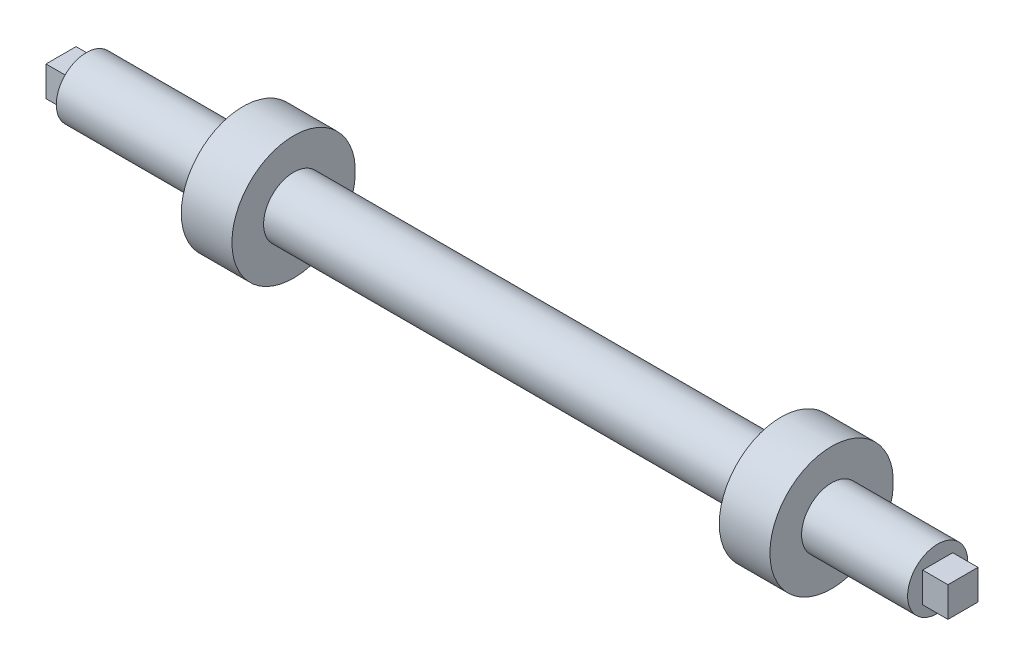
ISO-10303-21;
HEADER;
FILE_DESCRIPTION(('STEP AP214'),'2;1');
FILE_NAME('part.step','',(''),(''),'','','');
FILE_SCHEMA(('AUTOMOTIVE_DESIGN { 1 0 10303 214 1 1 1 1 }'));
ENDSEC;
DATA;
#1=APPLICATION_CONTEXT('core data for automotive mechanical design processes');
#2=APPLICATION_PROTOCOL_DEFINITION('international standard','automotive_design',2000,#1);
#3=PRODUCT_CONTEXT('',#1,'mechanical');
#4=PRODUCT('Part','Part','',(#3));
#5=PRODUCT_RELATED_PRODUCT_CATEGORY('part','',(#4));
#6=PRODUCT_DEFINITION_FORMATION('','',#4);
#7=PRODUCT_DEFINITION_CONTEXT('part definition',#1,'design');
#8=PRODUCT_DEFINITION('design','',#6,#7);
#9=PRODUCT_DEFINITION_SHAPE('','',#8);
#10=(LENGTH_UNIT() NAMED_UNIT(*) SI_UNIT(.MILLI.,.METRE.));
#11=(NAMED_UNIT(*) PLANE_ANGLE_UNIT() SI_UNIT($,.RADIAN.));
#12=(NAMED_UNIT(*) SI_UNIT($,.STERADIAN.) SOLID_ANGLE_UNIT());
#13=UNCERTAINTY_MEASURE_WITH_UNIT(LENGTH_MEASURE(1.E-05),#10,'distance_accuracy_value','');
#14=(GEOMETRIC_REPRESENTATION_CONTEXT(3) GLOBAL_UNCERTAINTY_ASSIGNED_CONTEXT((#13)) GLOBAL_UNIT_ASSIGNED_CONTEXT((#10,
#11,#12)) REPRESENTATION_CONTEXT('',''));
#15=CARTESIAN_POINT('',(0.,0.,0.));
#16=DIRECTION('',(0.,0.,1.));
#17=DIRECTION('',(1.,0.,0.));
#18=AXIS2_PLACEMENT_3D('',#15,#16,#17);
#19=CARTESIAN_POINT('',(0.,0.,-4.75));
#20=DIRECTION('',(-1.,0.,0.));
#21=DIRECTION('',(0.,0.,1.));
#22=AXIS2_PLACEMENT_3D('',#19,#20,#21);
#23=CYLINDRICAL_SURFACE('',#22,4.75);
#24=CARTESIAN_POINT('',(24.75,0.,-4.75));
#25=DIRECTION('',(-1.,0.,0.));
#26=DIRECTION('',(0.,0.,1.));
#27=AXIS2_PLACEMENT_3D('',#24,#25,#26);
#28=CIRCLE('',#27,4.75);
#29=CARTESIAN_POINT('',(24.75,0.,0.));
#30=VERTEX_POINT('',#29);
#31=EDGE_CURVE('E199',#30,#30,#28,.T.);
#32=ORIENTED_EDGE('',*,*,#31,.T.);
#33=EDGE_LOOP('',(#32));
#34=FACE_BOUND('',#33,.T.);
#35=CARTESIAN_POINT('',(0.,0.,-4.75));
#36=DIRECTION('',(-1.,0.,0.));
#37=DIRECTION('',(0.,0.,1.));
#38=AXIS2_PLACEMENT_3D('',#35,#36,#37);
#39=CIRCLE('',#38,4.75);
#40=CARTESIAN_POINT('',(0.,0.,0.));
#41=VERTEX_POINT('',#40);
#42=EDGE_CURVE('E11',#41,#41,#39,.T.);
#43=ORIENTED_EDGE('',*,*,#42,.F.);
#44=EDGE_LOOP('',(#43));
#45=FACE_BOUND('',#44,.T.);
#46=ADVANCED_FACE('F41',(#34,#45),#23,.T.);
#47=CARTESIAN_POINT('',(0.,0.,0.));
#48=DIRECTION('',(-1.,0.,0.));
#49=DIRECTION('',(0.,0.,1.));
#50=AXIS2_PLACEMENT_3D('',#47,#48,#49);
#51=PLANE('',#50);
#52=DIRECTION('',(0.,0.,-1.));
#53=VECTOR('',#52,1.);
#54=CARTESIAN_POINT('',(0.,2.375,-4.75));
#55=LINE('',#54,#53);
#56=CARTESIAN_POINT('',(0.,2.375,-2.375));
#57=VERTEX_POINT('',#56);
#58=CARTESIAN_POINT('',(0.,2.375,-7.125));
#59=VERTEX_POINT('',#58);
#60=EDGE_CURVE('E56',#57,#59,#55,.T.);
#61=ORIENTED_EDGE('',*,*,#60,.F.);
#62=DIRECTION('',(0.,1.,0.));
#63=VECTOR('',#62,1.);
#64=CARTESIAN_POINT('',(0.,-2.375,-2.375));
#65=LINE('',#64,#63);
#66=CARTESIAN_POINT('',(0.,-2.375,-2.375));
#67=VERTEX_POINT('',#66);
#68=EDGE_CURVE('E60',#67,#57,#65,.T.);
#69=ORIENTED_EDGE('',*,*,#68,.F.);
#70=DIRECTION('',(0.,0.,1.));
#71=VECTOR('',#70,1.);
#72=CARTESIAN_POINT('',(0.,-2.375,-7.125));
#73=LINE('',#72,#71);
#74=CARTESIAN_POINT('',(0.,-2.375,-7.125));
#75=VERTEX_POINT('',#74);
#76=EDGE_CURVE('E142',#75,#67,#73,.T.);
#77=ORIENTED_EDGE('',*,*,#76,.F.);
#78=DIRECTION('',(0.,-1.,0.));
#79=VECTOR('',#78,1.);
#80=CARTESIAN_POINT('',(0.,2.375,-7.125));
#81=LINE('',#80,#79);
#82=EDGE_CURVE('E139',#59,#75,#81,.T.);
#83=ORIENTED_EDGE('',*,*,#82,.F.);
#84=EDGE_LOOP('',(#61,#69,#77,#83));
#85=FACE_BOUND('',#84,.T.);
#86=ORIENTED_EDGE('',*,*,#42,.T.);
#87=EDGE_LOOP('',(#86));
#88=FACE_BOUND('',#87,.T.);
#89=ADVANCED_FACE('F239',(#85,#88),#51,.T.);
#90=CARTESIAN_POINT('',(134.5,0.,-4.75));
#91=DIRECTION('',(1.,0.,0.));
#92=DIRECTION('',(0.,0.,-1.));
#93=AXIS2_PLACEMENT_3D('',#90,#91,#92);
#94=PLANE('',#93);
#95=DIRECTION('',(0.,0.,1.));
#96=VECTOR('',#95,1.);
#97=CARTESIAN_POINT('',(134.5,2.375,-2.375));
#98=LINE('',#97,#96);
#99=CARTESIAN_POINT('',(134.5,2.375,-7.125));
#100=VERTEX_POINT('',#99);
#101=CARTESIAN_POINT('',(134.5,2.375,-2.375));
#102=VERTEX_POINT('',#101);
#103=EDGE_CURVE('E122',#100,#102,#98,.T.);
#104=ORIENTED_EDGE('',*,*,#103,.F.);
#105=DIRECTION('',(0.,1.,0.));
#106=VECTOR('',#105,1.);
#107=CARTESIAN_POINT('',(134.5,2.375,-7.125));
#108=LINE('',#107,#106);
#109=CARTESIAN_POINT('',(134.5,-2.375,-7.125));
#110=VERTEX_POINT('',#109);
#111=EDGE_CURVE('E160',#110,#100,#108,.T.);
#112=ORIENTED_EDGE('',*,*,#111,.F.);
#113=DIRECTION('',(0.,0.,-1.));
#114=VECTOR('',#113,1.);
#115=CARTESIAN_POINT('',(134.5,-2.375,-7.125));
#116=LINE('',#115,#114);
#117=CARTESIAN_POINT('',(134.5,-2.375,-2.375));
#118=VERTEX_POINT('',#117);
#119=EDGE_CURVE('E177',#118,#110,#116,.T.);
#120=ORIENTED_EDGE('',*,*,#119,.F.);
#121=DIRECTION('',(0.,-1.,0.));
#122=VECTOR('',#121,1.);
#123=CARTESIAN_POINT('',(134.5,2.375,-2.375));
#124=LINE('',#123,#122);
#125=EDGE_CURVE('E173',#102,#118,#124,.T.);
#126=ORIENTED_EDGE('',*,*,#125,.F.);
#127=EDGE_LOOP('',(#104,#112,#120,#126));
#128=FACE_BOUND('',#127,.T.);
#129=CARTESIAN_POINT('',(134.5,0.,-4.75));
#130=DIRECTION('',(-1.,0.,0.));
#131=DIRECTION('',(0.,0.,1.));
#132=AXIS2_PLACEMENT_3D('',#129,#130,#131);
#133=CIRCLE('',#132,4.75);
#134=CARTESIAN_POINT('',(134.5,0.,0.));
#135=VERTEX_POINT('',#134);
#136=EDGE_CURVE('E49',#135,#135,#133,.T.);
#137=ORIENTED_EDGE('',*,*,#136,.F.);
#138=EDGE_LOOP('',(#137));
#139=FACE_BOUND('',#138,.T.);
#140=ADVANCED_FACE('F237',(#128,#139),#94,.T.);
#141=CARTESIAN_POINT('',(0.,0.,-4.75));
#142=DIRECTION('',(-1.,0.,0.));
#143=DIRECTION('',(0.,0.,1.));
#144=AXIS2_PLACEMENT_3D('',#141,#142,#143);
#145=CYLINDRICAL_SURFACE('',#144,4.75);
#146=ORIENTED_EDGE('',*,*,#136,.T.);
#147=EDGE_LOOP('',(#146));
#148=FACE_BOUND('',#147,.T.);
#149=CARTESIAN_POINT('',(117.75,0.,-4.75));
#150=DIRECTION('',(-1.,0.,0.));
#151=DIRECTION('',(0.,0.,1.));
#152=AXIS2_PLACEMENT_3D('',#149,#150,#151);
#153=CIRCLE('',#152,4.75);
#154=CARTESIAN_POINT('',(117.75,0.,0.));
#155=VERTEX_POINT('',#154);
#156=EDGE_CURVE('E227',#155,#155,#153,.T.);
#157=ORIENTED_EDGE('',*,*,#156,.F.);
#158=EDGE_LOOP('',(#157));
#159=FACE_BOUND('',#158,.T.);
#160=ADVANCED_FACE('F234',(#148,#159),#145,.T.);
#161=CARTESIAN_POINT('',(117.75,0.,5.));
#162=DIRECTION('',(1.,0.,0.));
#163=DIRECTION('',(0.,0.,-1.));
#164=AXIS2_PLACEMENT_3D('',#161,#162,#163);
#165=PLANE('',#164);
#166=ORIENTED_EDGE('',*,*,#156,.T.);
#167=EDGE_LOOP('',(#166));
#168=FACE_BOUND('',#167,.T.);
#169=CARTESIAN_POINT('',(117.75,0.,-4.75));
#170=DIRECTION('',(-1.,0.,0.));
#171=DIRECTION('',(0.,0.,1.));
#172=AXIS2_PLACEMENT_3D('',#169,#170,#171);
#173=CIRCLE('',#172,9.75);
#174=CARTESIAN_POINT('',(117.75,0.,5.));
#175=VERTEX_POINT('',#174);
#176=EDGE_CURVE('E223',#175,#175,#173,.T.);
#177=ORIENTED_EDGE('',*,*,#176,.F.);
#178=EDGE_LOOP('',(#177));
#179=FACE_BOUND('',#178,.T.);
#180=ADVANCED_FACE('F246',(#168,#179),#165,.T.);
#181=CARTESIAN_POINT('',(0.,0.,-4.75));
#182=DIRECTION('',(-1.,0.,0.));
#183=DIRECTION('',(0.,0.,1.));
#184=AXIS2_PLACEMENT_3D('',#181,#182,#183);
#185=CYLINDRICAL_SURFACE('',#184,9.75);
#186=ORIENTED_EDGE('',*,*,#176,.T.);
#187=EDGE_LOOP('',(#186));
#188=FACE_BOUND('',#187,.T.);
#189=CARTESIAN_POINT('',(109.75,0.,-4.75));
#190=DIRECTION('',(-1.,0.,0.));
#191=DIRECTION('',(0.,0.,1.));
#192=AXIS2_PLACEMENT_3D('',#189,#190,#191);
#193=CIRCLE('',#192,9.75);
#194=CARTESIAN_POINT('',(109.75,0.,5.));
#195=VERTEX_POINT('',#194);
#196=EDGE_CURVE('E219',#195,#195,#193,.T.);
#197=ORIENTED_EDGE('',*,*,#196,.F.);
#198=EDGE_LOOP('',(#197));
#199=FACE_BOUND('',#198,.T.);
#200=ADVANCED_FACE('F285',(#188,#199),#185,.T.);
#201=CARTESIAN_POINT('',(109.75,0.,0.));
#202=DIRECTION('',(-1.,0.,0.));
#203=DIRECTION('',(0.,0.,1.));
#204=AXIS2_PLACEMENT_3D('',#201,#202,#203);
#205=PLANE('',#204);
#206=ORIENTED_EDGE('',*,*,#196,.T.);
#207=EDGE_LOOP('',(#206));
#208=FACE_BOUND('',#207,.T.);
#209=CARTESIAN_POINT('',(109.75,0.,-4.75));
#210=DIRECTION('',(-1.,0.,0.));
#211=DIRECTION('',(0.,0.,1.));
#212=AXIS2_PLACEMENT_3D('',#209,#210,#211);
#213=CIRCLE('',#212,4.75);
#214=CARTESIAN_POINT('',(109.75,0.,0.));
#215=VERTEX_POINT('',#214);
#216=EDGE_CURVE('E215',#215,#215,#213,.T.);
#217=ORIENTED_EDGE('',*,*,#216,.F.);
#218=EDGE_LOOP('',(#217));
#219=FACE_BOUND('',#218,.T.);
#220=ADVANCED_FACE('F281',(#208,#219),#205,.T.);
#221=CARTESIAN_POINT('',(0.,0.,-4.75));
#222=DIRECTION('',(-1.,0.,0.));
#223=DIRECTION('',(0.,0.,1.));
#224=AXIS2_PLACEMENT_3D('',#221,#222,#223);
#225=CYLINDRICAL_SURFACE('',#224,4.75);
#226=ORIENTED_EDGE('',*,*,#216,.T.);
#227=EDGE_LOOP('',(#226));
#228=FACE_BOUND('',#227,.T.);
#229=CARTESIAN_POINT('',(32.75,0.,-4.75));
#230=DIRECTION('',(-1.,0.,0.));
#231=DIRECTION('',(0.,0.,1.));
#232=AXIS2_PLACEMENT_3D('',#229,#230,#231);
#233=CIRCLE('',#232,4.75);
#234=CARTESIAN_POINT('',(32.75,0.,0.));
#235=VERTEX_POINT('',#234);
#236=EDGE_CURVE('E211',#235,#235,#233,.T.);
#237=ORIENTED_EDGE('',*,*,#236,.F.);
#238=EDGE_LOOP('',(#237));
#239=FACE_BOUND('',#238,.T.);
#240=ADVANCED_FACE('F277',(#228,#239),#225,.T.);
#241=CARTESIAN_POINT('',(32.75,0.,5.));
#242=DIRECTION('',(1.,0.,0.));
#243=DIRECTION('',(0.,0.,-1.));
#244=AXIS2_PLACEMENT_3D('',#241,#242,#243);
#245=PLANE('',#244);
#246=ORIENTED_EDGE('',*,*,#236,.T.);
#247=EDGE_LOOP('',(#246));
#248=FACE_BOUND('',#247,.T.);
#249=CARTESIAN_POINT('',(32.75,0.,-4.75));
#250=DIRECTION('',(-1.,0.,0.));
#251=DIRECTION('',(0.,0.,1.));
#252=AXIS2_PLACEMENT_3D('',#249,#250,#251);
#253=CIRCLE('',#252,9.75);
#254=CARTESIAN_POINT('',(32.75,0.,5.));
#255=VERTEX_POINT('',#254);
#256=EDGE_CURVE('E207',#255,#255,#253,.T.);
#257=ORIENTED_EDGE('',*,*,#256,.F.);
#258=EDGE_LOOP('',(#257));
#259=FACE_BOUND('',#258,.T.);
#260=ADVANCED_FACE('F270',(#248,#259),#245,.T.);
#261=CARTESIAN_POINT('',(0.,0.,-4.75));
#262=DIRECTION('',(-1.,0.,0.));
#263=DIRECTION('',(0.,0.,1.));
#264=AXIS2_PLACEMENT_3D('',#261,#262,#263);
#265=CYLINDRICAL_SURFACE('',#264,9.75);
#266=ORIENTED_EDGE('',*,*,#256,.T.);
#267=EDGE_LOOP('',(#266));
#268=FACE_BOUND('',#267,.T.);
#269=CARTESIAN_POINT('',(24.75,0.,-4.75));
#270=DIRECTION('',(-1.,0.,0.));
#271=DIRECTION('',(0.,0.,1.));
#272=AXIS2_PLACEMENT_3D('',#269,#270,#271);
#273=CIRCLE('',#272,9.75);
#274=CARTESIAN_POINT('',(24.75,0.,5.));
#275=VERTEX_POINT('',#274);
#276=EDGE_CURVE('E203',#275,#275,#273,.T.);
#277=ORIENTED_EDGE('',*,*,#276,.F.);
#278=EDGE_LOOP('',(#277));
#279=FACE_BOUND('',#278,.T.);
#280=ADVANCED_FACE('F260',(#268,#279),#265,.T.);
#281=CARTESIAN_POINT('',(24.75,0.,0.));
#282=DIRECTION('',(-1.,0.,0.));
#283=DIRECTION('',(0.,0.,1.));
#284=AXIS2_PLACEMENT_3D('',#281,#282,#283);
#285=PLANE('',#284);
#286=ORIENTED_EDGE('',*,*,#276,.T.);
#287=EDGE_LOOP('',(#286));
#288=FACE_BOUND('',#287,.T.);
#289=ORIENTED_EDGE('',*,*,#31,.F.);
#290=EDGE_LOOP('',(#289));
#291=FACE_BOUND('',#290,.T.);
#292=ADVANCED_FACE('F257',(#288,#291),#285,.T.);
#293=CARTESIAN_POINT('',(138.5,2.375,-2.375));
#294=DIRECTION('',(0.,-1.,0.));
#295=DIRECTION('',(0.,0.,-1.));
#296=AXIS2_PLACEMENT_3D('',#293,#294,#295);
#297=PLANE('',#296);
#298=ORIENTED_EDGE('',*,*,#103,.T.);
#299=DIRECTION('',(-1.,0.,0.));
#300=VECTOR('',#299,1.);
#301=CARTESIAN_POINT('',(138.5,2.375,-2.375));
#302=LINE('',#301,#300);
#303=CARTESIAN_POINT('',(138.5,2.375,-2.375));
#304=VERTEX_POINT('',#303);
#305=EDGE_CURVE('E195',#304,#102,#302,.T.);
#306=ORIENTED_EDGE('',*,*,#305,.F.);
#307=DIRECTION('',(0.,0.,1.));
#308=VECTOR('',#307,1.);
#309=CARTESIAN_POINT('',(138.5,2.375,-2.375));
#310=LINE('',#309,#308);
#311=CARTESIAN_POINT('',(138.5,2.375,-7.125));
#312=VERTEX_POINT('',#311);
#313=EDGE_CURVE('E155',#312,#304,#310,.T.);
#314=ORIENTED_EDGE('',*,*,#313,.F.);
#315=DIRECTION('',(-1.,0.,0.));
#316=VECTOR('',#315,1.);
#317=CARTESIAN_POINT('',(138.5,2.375,-7.125));
#318=LINE('',#317,#316);
#319=EDGE_CURVE('E169',#312,#100,#318,.T.);
#320=ORIENTED_EDGE('',*,*,#319,.T.);
#321=EDGE_LOOP('',(#298,#306,#314,#320));
#322=FACE_BOUND('',#321,.T.);
#323=ADVANCED_FACE('F259',(#322),#297,.F.);
#324=CARTESIAN_POINT('',(138.5,2.375,-2.375));
#325=DIRECTION('',(0.,0.,-1.));
#326=DIRECTION('',(0.,1.,0.));
#327=AXIS2_PLACEMENT_3D('',#324,#325,#326);
#328=PLANE('',#327);
#329=ORIENTED_EDGE('',*,*,#125,.T.);
#330=DIRECTION('',(-1.,0.,0.));
#331=VECTOR('',#330,1.);
#332=CARTESIAN_POINT('',(138.5,-2.375,-2.375));
#333=LINE('',#332,#331);
#334=CARTESIAN_POINT('',(138.5,-2.375,-2.375));
#335=VERTEX_POINT('',#334);
#336=EDGE_CURVE('E191',#335,#118,#333,.T.);
#337=ORIENTED_EDGE('',*,*,#336,.F.);
#338=DIRECTION('',(0.,-1.,0.));
#339=VECTOR('',#338,1.);
#340=CARTESIAN_POINT('',(138.5,2.375,-2.375));
#341=LINE('',#340,#339);
#342=EDGE_CURVE('E159',#304,#335,#341,.T.);
#343=ORIENTED_EDGE('',*,*,#342,.F.);
#344=ORIENTED_EDGE('',*,*,#305,.T.);
#345=EDGE_LOOP('',(#329,#337,#343,#344));
#346=FACE_BOUND('',#345,.T.);
#347=ADVANCED_FACE('F267',(#346),#328,.F.);
#348=CARTESIAN_POINT('',(138.5,-2.375,-7.125));
#349=DIRECTION('',(0.,1.,0.));
#350=DIRECTION('',(0.,0.,1.));
#351=AXIS2_PLACEMENT_3D('',#348,#349,#350);
#352=PLANE('',#351);
#353=ORIENTED_EDGE('',*,*,#119,.T.);
#354=DIRECTION('',(-1.,0.,0.));
#355=VECTOR('',#354,1.);
#356=CARTESIAN_POINT('',(138.5,-2.375,-7.125));
#357=LINE('',#356,#355);
#358=CARTESIAN_POINT('',(138.5,-2.375,-7.125));
#359=VERTEX_POINT('',#358);
#360=EDGE_CURVE('E187',#359,#110,#357,.T.);
#361=ORIENTED_EDGE('',*,*,#360,.F.);
#362=DIRECTION('',(0.,0.,-1.));
#363=VECTOR('',#362,1.);
#364=CARTESIAN_POINT('',(138.5,-2.375,-7.125));
#365=LINE('',#364,#363);
#366=EDGE_CURVE('E163',#335,#359,#365,.T.);
#367=ORIENTED_EDGE('',*,*,#366,.F.);
#368=ORIENTED_EDGE('',*,*,#336,.T.);
#369=EDGE_LOOP('',(#353,#361,#367,#368));
#370=FACE_BOUND('',#369,.T.);
#371=ADVANCED_FACE('F349',(#370),#352,.F.);
#372=CARTESIAN_POINT('',(138.5,2.375,-7.125));
#373=DIRECTION('',(0.,0.,1.));
#374=DIRECTION('',(1.,0.,0.));
#375=AXIS2_PLACEMENT_3D('',#372,#373,#374);
#376=PLANE('',#375);
#377=ORIENTED_EDGE('',*,*,#111,.T.);
#378=ORIENTED_EDGE('',*,*,#319,.F.);
#379=DIRECTION('',(0.,1.,0.));
#380=VECTOR('',#379,1.);
#381=CARTESIAN_POINT('',(138.5,2.375,-7.125));
#382=LINE('',#381,#380);
#383=EDGE_CURVE('E166',#359,#312,#382,.T.);
#384=ORIENTED_EDGE('',*,*,#383,.F.);
#385=ORIENTED_EDGE('',*,*,#360,.T.);
#386=EDGE_LOOP('',(#377,#378,#384,#385));
#387=FACE_BOUND('',#386,.T.);
#388=ADVANCED_FACE('F358',(#387),#376,.F.);
#389=CARTESIAN_POINT('',(138.5,0.,0.));
#390=DIRECTION('',(-1.,0.,0.));
#391=DIRECTION('',(0.,0.,1.));
#392=AXIS2_PLACEMENT_3D('',#389,#390,#391);
#393=PLANE('',#392);
#394=ORIENTED_EDGE('',*,*,#313,.T.);
#395=ORIENTED_EDGE('',*,*,#342,.T.);
#396=ORIENTED_EDGE('',*,*,#366,.T.);
#397=ORIENTED_EDGE('',*,*,#383,.T.);
#398=EDGE_LOOP('',(#394,#395,#396,#397));
#399=FACE_BOUND('',#398,.T.);
#400=ADVANCED_FACE('F368',(#399),#393,.F.);
#401=CARTESIAN_POINT('',(-4.,2.375,-4.75));
#402=DIRECTION('',(0.,-1.,0.));
#403=DIRECTION('',(0.,0.,-1.));
#404=AXIS2_PLACEMENT_3D('',#401,#402,#403);
#405=PLANE('',#404);
#406=ORIENTED_EDGE('',*,*,#60,.T.);
#407=DIRECTION('',(1.,0.,0.));
#408=VECTOR('',#407,1.);
#409=CARTESIAN_POINT('',(-4.,2.375,-7.125));
#410=LINE('',#409,#408);
#411=CARTESIAN_POINT('',(-4.,2.375,-7.125));
#412=VERTEX_POINT('',#411);
#413=EDGE_CURVE('E117',#412,#59,#410,.T.);
#414=ORIENTED_EDGE('',*,*,#413,.F.);
#415=DIRECTION('',(0.,0.,-1.));
#416=VECTOR('',#415,1.);
#417=CARTESIAN_POINT('',(-4.,2.375,-2.375));
#418=LINE('',#417,#416);
#419=CARTESIAN_POINT('',(-4.,2.375,-2.375));
#420=VERTEX_POINT('',#419);
#421=EDGE_CURVE('E103',#420,#412,#418,.T.);
#422=ORIENTED_EDGE('',*,*,#421,.F.);
#423=DIRECTION('',(1.,0.,0.));
#424=VECTOR('',#423,1.);
#425=CARTESIAN_POINT('',(-4.,2.375,-2.375));
#426=LINE('',#425,#424);
#427=EDGE_CURVE('E136',#420,#57,#426,.T.);
#428=ORIENTED_EDGE('',*,*,#427,.T.);
#429=EDGE_LOOP('',(#406,#414,#422,#428));
#430=FACE_BOUND('',#429,.T.);
#431=ADVANCED_FACE('F118',(#430),#405,.F.);
#432=CARTESIAN_POINT('',(-4.,2.375,-7.125));
#433=DIRECTION('',(0.,0.,1.));
#434=DIRECTION('',(1.,0.,0.));
#435=AXIS2_PLACEMENT_3D('',#432,#433,#434);
#436=PLANE('',#435);
#437=ORIENTED_EDGE('',*,*,#82,.T.);
#438=DIRECTION('',(1.,0.,0.));
#439=VECTOR('',#438,1.);
#440=CARTESIAN_POINT('',(-4.,-2.375,-7.125));
#441=LINE('',#440,#439);
#442=CARTESIAN_POINT('',(-4.,-2.375,-7.125));
#443=VERTEX_POINT('',#442);
#444=EDGE_CURVE('E123',#443,#75,#441,.T.);
#445=ORIENTED_EDGE('',*,*,#444,.F.);
#446=DIRECTION('',(0.,-1.,0.));
#447=VECTOR('',#446,1.);
#448=CARTESIAN_POINT('',(-4.,2.375,-7.125));
#449=LINE('',#448,#447);
#450=EDGE_CURVE('E107',#412,#443,#449,.T.);
#451=ORIENTED_EDGE('',*,*,#450,.F.);
#452=ORIENTED_EDGE('',*,*,#413,.T.);
#453=EDGE_LOOP('',(#437,#445,#451,#452));
#454=FACE_BOUND('',#453,.T.);
#455=ADVANCED_FACE('F125',(#454),#436,.F.);
#456=CARTESIAN_POINT('',(-4.,-2.375,-7.125));
#457=DIRECTION('',(0.,1.,0.));
#458=DIRECTION('',(0.,0.,1.));
#459=AXIS2_PLACEMENT_3D('',#456,#457,#458);
#460=PLANE('',#459);
#461=ORIENTED_EDGE('',*,*,#76,.T.);
#462=DIRECTION('',(1.,0.,0.));
#463=VECTOR('',#462,1.);
#464=CARTESIAN_POINT('',(-4.,-2.375,-2.375));
#465=LINE('',#464,#463);
#466=CARTESIAN_POINT('',(-4.,-2.375,-2.375));
#467=VERTEX_POINT('',#466);
#468=EDGE_CURVE('E149',#467,#67,#465,.T.);
#469=ORIENTED_EDGE('',*,*,#468,.F.);
#470=DIRECTION('',(0.,0.,1.));
#471=VECTOR('',#470,1.);
#472=CARTESIAN_POINT('',(-4.,-2.375,-7.125));
#473=LINE('',#472,#471);
#474=EDGE_CURVE('E129',#443,#467,#473,.T.);
#475=ORIENTED_EDGE('',*,*,#474,.F.);
#476=ORIENTED_EDGE('',*,*,#444,.T.);
#477=EDGE_LOOP('',(#461,#469,#475,#476));
#478=FACE_BOUND('',#477,.T.);
#479=ADVANCED_FACE('F399',(#478),#460,.F.);
#480=CARTESIAN_POINT('',(-4.,-2.375,-2.375));
#481=DIRECTION('',(0.,0.,-1.));
#482=DIRECTION('',(-1.,0.,0.));
#483=AXIS2_PLACEMENT_3D('',#480,#481,#482);
#484=PLANE('',#483);
#485=ORIENTED_EDGE('',*,*,#68,.T.);
#486=ORIENTED_EDGE('',*,*,#427,.F.);
#487=DIRECTION('',(0.,1.,0.));
#488=VECTOR('',#487,1.);
#489=CARTESIAN_POINT('',(-4.,-2.375,-2.375));
#490=LINE('',#489,#488);
#491=EDGE_CURVE('E110',#467,#420,#490,.T.);
#492=ORIENTED_EDGE('',*,*,#491,.F.);
#493=ORIENTED_EDGE('',*,*,#468,.T.);
#494=EDGE_LOOP('',(#485,#486,#492,#493));
#495=FACE_BOUND('',#494,.T.);
#496=ADVANCED_FACE('F408',(#495),#484,.F.);
#497=CARTESIAN_POINT('',(-4.,0.,0.));
#498=DIRECTION('',(-1.,0.,0.));
#499=DIRECTION('',(0.,0.,1.));
#500=AXIS2_PLACEMENT_3D('',#497,#498,#499);
#501=PLANE('',#500);
#502=ORIENTED_EDGE('',*,*,#421,.T.);
#503=ORIENTED_EDGE('',*,*,#450,.T.);
#504=ORIENTED_EDGE('',*,*,#474,.T.);
#505=ORIENTED_EDGE('',*,*,#491,.T.);
#506=EDGE_LOOP('',(#502,#503,#504,#505));
#507=FACE_BOUND('',#506,.T.);
#508=ADVANCED_FACE('F105',(#507),#501,.T.);
#509=CLOSED_SHELL('',(#46,#89,#140,#160,#180,#200,#220,#240,#260,#280,#292,#323,#347,#371,#388,
#400,#431,#455,#479,#496,#508));
#510=MANIFOLD_SOLID_BREP('B2',#509);
#511=ADVANCED_BREP_SHAPE_REPRESENTATION('',(#18,#510),#14);
#512=SHAPE_DEFINITION_REPRESENTATION(#9,#511);
ENDSEC;
END-ISO-10303-21;
